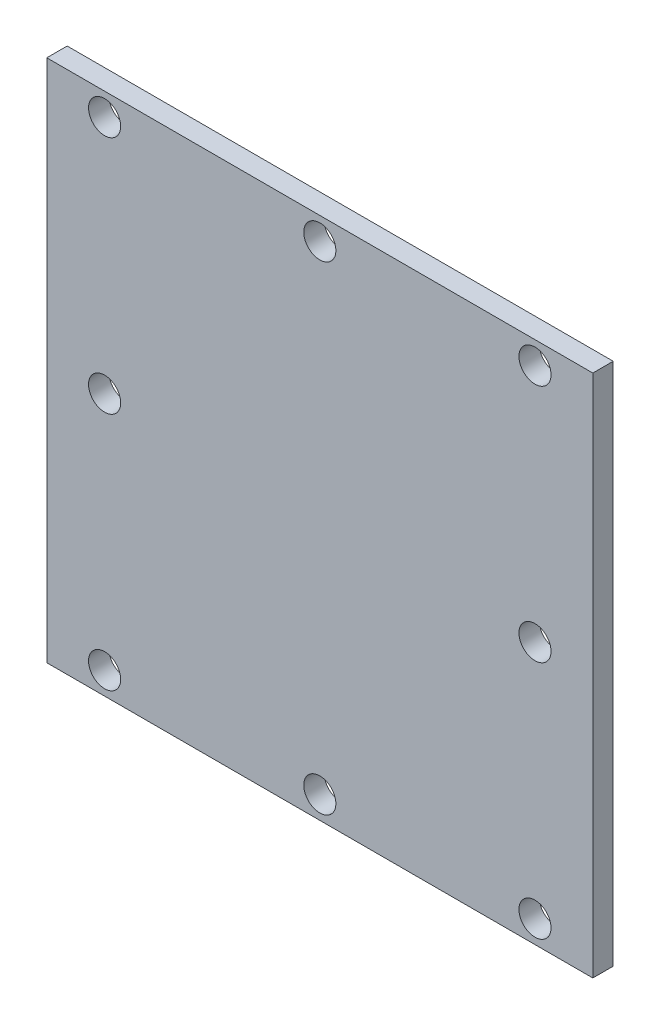
ISO-10303-21;
HEADER;
FILE_DESCRIPTION(('STEP AP214'),'2;1');
FILE_NAME('part.step','',(''),(''),'','','');
FILE_SCHEMA(('AUTOMOTIVE_DESIGN { 1 0 10303 214 1 1 1 1 }'));
ENDSEC;
DATA;
#1=APPLICATION_CONTEXT('core data for automotive mechanical design processes');
#2=APPLICATION_PROTOCOL_DEFINITION('international standard','automotive_design',2000,#1);
#3=PRODUCT_CONTEXT('',#1,'mechanical');
#4=PRODUCT('Part','Part','',(#3));
#5=PRODUCT_RELATED_PRODUCT_CATEGORY('part','',(#4));
#6=PRODUCT_DEFINITION_FORMATION('','',#4);
#7=PRODUCT_DEFINITION_CONTEXT('part definition',#1,'design');
#8=PRODUCT_DEFINITION('design','',#6,#7);
#9=PRODUCT_DEFINITION_SHAPE('','',#8);
#10=(LENGTH_UNIT() NAMED_UNIT(*) SI_UNIT(.MILLI.,.METRE.));
#11=(NAMED_UNIT(*) PLANE_ANGLE_UNIT() SI_UNIT($,.RADIAN.));
#12=(NAMED_UNIT(*) SI_UNIT($,.STERADIAN.) SOLID_ANGLE_UNIT());
#13=UNCERTAINTY_MEASURE_WITH_UNIT(LENGTH_MEASURE(1.E-05),#10,'distance_accuracy_value','');
#14=(GEOMETRIC_REPRESENTATION_CONTEXT(3) GLOBAL_UNCERTAINTY_ASSIGNED_CONTEXT((#13)) GLOBAL_UNIT_ASSIGNED_CONTEXT((#10,
#11,#12)) REPRESENTATION_CONTEXT('',''));
#15=CARTESIAN_POINT('',(0.,0.,0.));
#16=DIRECTION('',(0.,0.,1.));
#17=DIRECTION('',(1.,0.,0.));
#18=AXIS2_PLACEMENT_3D('',#15,#16,#17);
#19=CARTESIAN_POINT('',(170.,0.,-6.35));
#20=DIRECTION('',(0.,-1.,0.));
#21=DIRECTION('',(0.,0.,-1.));
#22=AXIS2_PLACEMENT_3D('',#19,#20,#21);
#23=PLANE('',#22);
#24=DIRECTION('',(1.,0.,0.));
#25=VECTOR('',#24,1.);
#26=CARTESIAN_POINT('',(170.,0.,0.));
#27=LINE('',#26,#25);
#28=CARTESIAN_POINT('',(0.,0.,0.));
#29=VERTEX_POINT('',#28);
#30=CARTESIAN_POINT('',(170.,0.,0.));
#31=VERTEX_POINT('',#30);
#32=EDGE_CURVE('E98',#29,#31,#27,.T.);
#33=ORIENTED_EDGE('',*,*,#32,.F.);
#34=DIRECTION('',(0.,0.,1.));
#35=VECTOR('',#34,1.);
#36=CARTESIAN_POINT('',(0.,0.,-6.35));
#37=LINE('',#36,#35);
#38=CARTESIAN_POINT('',(0.,0.,-6.35));
#39=VERTEX_POINT('',#38);
#40=EDGE_CURVE('E11',#39,#29,#37,.T.);
#41=ORIENTED_EDGE('',*,*,#40,.F.);
#42=DIRECTION('',(1.,0.,0.));
#43=VECTOR('',#42,1.);
#44=CARTESIAN_POINT('',(170.,0.,-6.35));
#45=LINE('',#44,#43);
#46=CARTESIAN_POINT('',(170.,0.,-6.35));
#47=VERTEX_POINT('',#46);
#48=EDGE_CURVE('E91',#39,#47,#45,.T.);
#49=ORIENTED_EDGE('',*,*,#48,.T.);
#50=DIRECTION('',(0.,0.,1.));
#51=VECTOR('',#50,1.);
#52=CARTESIAN_POINT('',(170.,0.,-6.35));
#53=LINE('',#52,#51);
#54=EDGE_CURVE('E36',#47,#31,#53,.T.);
#55=ORIENTED_EDGE('',*,*,#54,.T.);
#56=EDGE_LOOP('',(#33,#41,#49,#55));
#57=FACE_BOUND('',#56,.T.);
#58=ADVANCED_FACE('F33',(#57),#23,.T.);
#59=CARTESIAN_POINT('',(0.,0.,-6.35));
#60=DIRECTION('',(-1.,0.,0.));
#61=DIRECTION('',(0.,0.,1.));
#62=AXIS2_PLACEMENT_3D('',#59,#60,#61);
#63=PLANE('',#62);
#64=DIRECTION('',(0.,-1.,0.));
#65=VECTOR('',#64,1.);
#66=CARTESIAN_POINT('',(0.,0.,0.));
#67=LINE('',#66,#65);
#68=CARTESIAN_POINT('',(0.,163.12,0.));
#69=VERTEX_POINT('',#68);
#70=EDGE_CURVE('E93',#69,#29,#67,.T.);
#71=ORIENTED_EDGE('',*,*,#70,.F.);
#72=DIRECTION('',(0.,0.,1.));
#73=VECTOR('',#72,1.);
#74=CARTESIAN_POINT('',(0.,163.12,-6.35));
#75=LINE('',#74,#73);
#76=CARTESIAN_POINT('',(0.,163.12,-6.35));
#77=VERTEX_POINT('',#76);
#78=EDGE_CURVE('E42',#77,#69,#75,.T.);
#79=ORIENTED_EDGE('',*,*,#78,.F.);
#80=DIRECTION('',(0.,-1.,0.));
#81=VECTOR('',#80,1.);
#82=CARTESIAN_POINT('',(0.,0.,-6.35));
#83=LINE('',#82,#81);
#84=EDGE_CURVE('E88',#77,#39,#83,.T.);
#85=ORIENTED_EDGE('',*,*,#84,.T.);
#86=ORIENTED_EDGE('',*,*,#40,.T.);
#87=EDGE_LOOP('',(#71,#79,#85,#86));
#88=FACE_BOUND('',#87,.T.);
#89=ADVANCED_FACE('F109',(#88),#63,.T.);
#90=CARTESIAN_POINT('',(0.,163.12,-6.35));
#91=DIRECTION('',(0.,1.,0.));
#92=DIRECTION('',(0.,0.,1.));
#93=AXIS2_PLACEMENT_3D('',#90,#91,#92);
#94=PLANE('',#93);
#95=DIRECTION('',(-1.,0.,0.));
#96=VECTOR('',#95,1.);
#97=CARTESIAN_POINT('',(0.,163.12,0.));
#98=LINE('',#97,#96);
#99=CARTESIAN_POINT('',(170.,163.12,0.));
#100=VERTEX_POINT('',#99);
#101=EDGE_CURVE('E83',#100,#69,#98,.T.);
#102=ORIENTED_EDGE('',*,*,#101,.F.);
#103=DIRECTION('',(0.,0.,1.));
#104=VECTOR('',#103,1.);
#105=CARTESIAN_POINT('',(170.,163.12,-6.35));
#106=LINE('',#105,#104);
#107=CARTESIAN_POINT('',(170.,163.12,-6.35));
#108=VERTEX_POINT('',#107);
#109=EDGE_CURVE('E78',#108,#100,#106,.T.);
#110=ORIENTED_EDGE('',*,*,#109,.F.);
#111=DIRECTION('',(-1.,0.,0.));
#112=VECTOR('',#111,1.);
#113=CARTESIAN_POINT('',(0.,163.12,-6.35));
#114=LINE('',#113,#112);
#115=EDGE_CURVE('E81',#108,#77,#114,.T.);
#116=ORIENTED_EDGE('',*,*,#115,.T.);
#117=ORIENTED_EDGE('',*,*,#78,.T.);
#118=EDGE_LOOP('',(#102,#110,#116,#117));
#119=FACE_BOUND('',#118,.T.);
#120=ADVANCED_FACE('F80',(#119),#94,.T.);
#121=CARTESIAN_POINT('',(170.,163.12,-6.35));
#122=DIRECTION('',(1.,0.,0.));
#123=DIRECTION('',(0.,0.,-1.));
#124=AXIS2_PLACEMENT_3D('',#121,#122,#123);
#125=PLANE('',#124);
#126=DIRECTION('',(0.,1.,0.));
#127=VECTOR('',#126,1.);
#128=CARTESIAN_POINT('',(170.,163.12,0.));
#129=LINE('',#128,#127);
#130=EDGE_CURVE('E101',#31,#100,#129,.T.);
#131=ORIENTED_EDGE('',*,*,#130,.F.);
#132=ORIENTED_EDGE('',*,*,#54,.F.);
#133=DIRECTION('',(0.,1.,0.));
#134=VECTOR('',#133,1.);
#135=CARTESIAN_POINT('',(170.,163.12,-6.35));
#136=LINE('',#135,#134);
#137=EDGE_CURVE('E87',#47,#108,#136,.T.);
#138=ORIENTED_EDGE('',*,*,#137,.T.);
#139=ORIENTED_EDGE('',*,*,#109,.T.);
#140=EDGE_LOOP('',(#131,#132,#138,#139));
#141=FACE_BOUND('',#140,.T.);
#142=ADVANCED_FACE('F90',(#141),#125,.T.);
#143=CARTESIAN_POINT('',(0.,0.,-6.35));
#144=DIRECTION('',(0.,0.,-1.));
#145=DIRECTION('',(-1.,0.,0.));
#146=AXIS2_PLACEMENT_3D('',#143,#144,#145);
#147=PLANE('',#146);
#148=CARTESIAN_POINT('',(85.,156.12,-6.35));
#149=DIRECTION('',(0.,0.,1.));
#150=DIRECTION('',(1.,0.,0.));
#151=AXIS2_PLACEMENT_3D('',#148,#149,#150);
#152=CIRCLE('',#151,5.00000000000001);
#153=CARTESIAN_POINT('',(90.,156.12,-6.35));
#154=VERTEX_POINT('',#153);
#155=EDGE_CURVE('E166',#154,#154,#152,.T.);
#156=ORIENTED_EDGE('',*,*,#155,.T.);
#157=EDGE_LOOP('',(#156));
#158=FACE_BOUND('',#157,.T.);
#159=CARTESIAN_POINT('',(152.,156.12,-6.35));
#160=DIRECTION('',(0.,0.,1.));
#161=DIRECTION('',(1.,0.,0.));
#162=AXIS2_PLACEMENT_3D('',#159,#160,#161);
#163=CIRCLE('',#162,4.99999999999999);
#164=CARTESIAN_POINT('',(157.,156.12,-6.35));
#165=VERTEX_POINT('',#164);
#166=EDGE_CURVE('E174',#165,#165,#163,.T.);
#167=ORIENTED_EDGE('',*,*,#166,.T.);
#168=EDGE_LOOP('',(#167));
#169=FACE_BOUND('',#168,.T.);
#170=CARTESIAN_POINT('',(152.,81.56,-6.35));
#171=DIRECTION('',(0.,0.,1.));
#172=DIRECTION('',(1.,0.,0.));
#173=AXIS2_PLACEMENT_3D('',#170,#171,#172);
#174=CIRCLE('',#173,4.99999999999999);
#175=CARTESIAN_POINT('',(157.,81.56,-6.35));
#176=VERTEX_POINT('',#175);
#177=EDGE_CURVE('E180',#176,#176,#174,.T.);
#178=ORIENTED_EDGE('',*,*,#177,.T.);
#179=EDGE_LOOP('',(#178));
#180=FACE_BOUND('',#179,.T.);
#181=CARTESIAN_POINT('',(18.,156.12,-6.35));
#182=DIRECTION('',(0.,0.,1.));
#183=DIRECTION('',(1.,0.,0.));
#184=AXIS2_PLACEMENT_3D('',#181,#182,#183);
#185=CIRCLE('',#184,5.);
#186=CARTESIAN_POINT('',(23.,156.12,-6.35));
#187=VERTEX_POINT('',#186);
#188=EDGE_CURVE('E186',#187,#187,#185,.T.);
#189=ORIENTED_EDGE('',*,*,#188,.T.);
#190=EDGE_LOOP('',(#189));
#191=FACE_BOUND('',#190,.T.);
#192=CARTESIAN_POINT('',(18.,81.56,-6.35));
#193=DIRECTION('',(0.,0.,1.));
#194=DIRECTION('',(1.,0.,0.));
#195=AXIS2_PLACEMENT_3D('',#192,#193,#194);
#196=CIRCLE('',#195,5.);
#197=CARTESIAN_POINT('',(23.,81.56,-6.35));
#198=VERTEX_POINT('',#197);
#199=EDGE_CURVE('E192',#198,#198,#196,.T.);
#200=ORIENTED_EDGE('',*,*,#199,.T.);
#201=EDGE_LOOP('',(#200));
#202=FACE_BOUND('',#201,.T.);
#203=CARTESIAN_POINT('',(18.,7.00000000000003,-6.35));
#204=DIRECTION('',(0.,0.,1.));
#205=DIRECTION('',(1.,0.,0.));
#206=AXIS2_PLACEMENT_3D('',#203,#204,#205);
#207=CIRCLE('',#206,5.);
#208=CARTESIAN_POINT('',(23.,7.00000000000003,-6.35));
#209=VERTEX_POINT('',#208);
#210=EDGE_CURVE('E198',#209,#209,#207,.T.);
#211=ORIENTED_EDGE('',*,*,#210,.T.);
#212=EDGE_LOOP('',(#211));
#213=FACE_BOUND('',#212,.T.);
#214=CARTESIAN_POINT('',(152.,7.00000000000003,-6.35));
#215=DIRECTION('',(0.,0.,1.));
#216=DIRECTION('',(1.,0.,0.));
#217=AXIS2_PLACEMENT_3D('',#214,#215,#216);
#218=CIRCLE('',#217,4.99999999999999);
#219=CARTESIAN_POINT('',(157.,7.00000000000003,-6.35));
#220=VERTEX_POINT('',#219);
#221=EDGE_CURVE('E204',#220,#220,#218,.T.);
#222=ORIENTED_EDGE('',*,*,#221,.T.);
#223=EDGE_LOOP('',(#222));
#224=FACE_BOUND('',#223,.T.);
#225=CARTESIAN_POINT('',(85.,7.00000000000003,-6.35));
#226=DIRECTION('',(0.,0.,1.));
#227=DIRECTION('',(1.,0.,0.));
#228=AXIS2_PLACEMENT_3D('',#225,#226,#227);
#229=CIRCLE('',#228,5.);
#230=CARTESIAN_POINT('',(90.,7.00000000000003,-6.35));
#231=VERTEX_POINT('',#230);
#232=EDGE_CURVE('E102',#231,#231,#229,.T.);
#233=ORIENTED_EDGE('',*,*,#232,.T.);
#234=EDGE_LOOP('',(#233));
#235=FACE_BOUND('',#234,.T.);
#236=ORIENTED_EDGE('',*,*,#48,.F.);
#237=ORIENTED_EDGE('',*,*,#84,.F.);
#238=ORIENTED_EDGE('',*,*,#115,.F.);
#239=ORIENTED_EDGE('',*,*,#137,.F.);
#240=EDGE_LOOP('',(#236,#237,#238,#239));
#241=FACE_BOUND('',#240,.T.);
#242=ADVANCED_FACE('F86',(#158,#169,#180,#191,#202,#213,#224,#235,#241),#147,.T.);
#243=CARTESIAN_POINT('',(0.,0.,0.));
#244=DIRECTION('',(0.,0.,-1.));
#245=DIRECTION('',(-1.,0.,0.));
#246=AXIS2_PLACEMENT_3D('',#243,#244,#245);
#247=PLANE('',#246);
#248=CARTESIAN_POINT('',(85.,156.12,0.));
#249=DIRECTION('',(0.,0.,1.));
#250=DIRECTION('',(1.,0.,0.));
#251=AXIS2_PLACEMENT_3D('',#248,#249,#250);
#252=CIRCLE('',#251,5.00000000000001);
#253=CARTESIAN_POINT('',(90.,156.12,0.));
#254=VERTEX_POINT('',#253);
#255=EDGE_CURVE('E169',#254,#254,#252,.T.);
#256=ORIENTED_EDGE('',*,*,#255,.F.);
#257=EDGE_LOOP('',(#256));
#258=FACE_BOUND('',#257,.T.);
#259=CARTESIAN_POINT('',(152.,156.12,0.));
#260=DIRECTION('',(0.,0.,1.));
#261=DIRECTION('',(1.,0.,0.));
#262=AXIS2_PLACEMENT_3D('',#259,#260,#261);
#263=CIRCLE('',#262,4.99999999999999);
#264=CARTESIAN_POINT('',(157.,156.12,0.));
#265=VERTEX_POINT('',#264);
#266=EDGE_CURVE('E171',#265,#265,#263,.T.);
#267=ORIENTED_EDGE('',*,*,#266,.F.);
#268=EDGE_LOOP('',(#267));
#269=FACE_BOUND('',#268,.T.);
#270=CARTESIAN_POINT('',(152.,81.56,0.));
#271=DIRECTION('',(0.,0.,1.));
#272=DIRECTION('',(1.,0.,0.));
#273=AXIS2_PLACEMENT_3D('',#270,#271,#272);
#274=CIRCLE('',#273,4.99999999999999);
#275=CARTESIAN_POINT('',(157.,81.56,0.));
#276=VERTEX_POINT('',#275);
#277=EDGE_CURVE('E177',#276,#276,#274,.T.);
#278=ORIENTED_EDGE('',*,*,#277,.F.);
#279=EDGE_LOOP('',(#278));
#280=FACE_BOUND('',#279,.T.);
#281=CARTESIAN_POINT('',(18.,156.12,0.));
#282=DIRECTION('',(0.,0.,1.));
#283=DIRECTION('',(1.,0.,0.));
#284=AXIS2_PLACEMENT_3D('',#281,#282,#283);
#285=CIRCLE('',#284,5.);
#286=CARTESIAN_POINT('',(23.,156.12,0.));
#287=VERTEX_POINT('',#286);
#288=EDGE_CURVE('E183',#287,#287,#285,.T.);
#289=ORIENTED_EDGE('',*,*,#288,.F.);
#290=EDGE_LOOP('',(#289));
#291=FACE_BOUND('',#290,.T.);
#292=CARTESIAN_POINT('',(18.,81.56,0.));
#293=DIRECTION('',(0.,0.,1.));
#294=DIRECTION('',(1.,0.,0.));
#295=AXIS2_PLACEMENT_3D('',#292,#293,#294);
#296=CIRCLE('',#295,5.);
#297=CARTESIAN_POINT('',(23.,81.56,0.));
#298=VERTEX_POINT('',#297);
#299=EDGE_CURVE('E189',#298,#298,#296,.T.);
#300=ORIENTED_EDGE('',*,*,#299,.F.);
#301=EDGE_LOOP('',(#300));
#302=FACE_BOUND('',#301,.T.);
#303=CARTESIAN_POINT('',(18.,7.00000000000003,0.));
#304=DIRECTION('',(0.,0.,1.));
#305=DIRECTION('',(1.,0.,0.));
#306=AXIS2_PLACEMENT_3D('',#303,#304,#305);
#307=CIRCLE('',#306,5.);
#308=CARTESIAN_POINT('',(23.,7.00000000000003,0.));
#309=VERTEX_POINT('',#308);
#310=EDGE_CURVE('E195',#309,#309,#307,.T.);
#311=ORIENTED_EDGE('',*,*,#310,.F.);
#312=EDGE_LOOP('',(#311));
#313=FACE_BOUND('',#312,.T.);
#314=CARTESIAN_POINT('',(152.,7.00000000000003,0.));
#315=DIRECTION('',(0.,0.,1.));
#316=DIRECTION('',(1.,0.,0.));
#317=AXIS2_PLACEMENT_3D('',#314,#315,#316);
#318=CIRCLE('',#317,4.99999999999999);
#319=CARTESIAN_POINT('',(157.,7.00000000000003,0.));
#320=VERTEX_POINT('',#319);
#321=EDGE_CURVE('E201',#320,#320,#318,.T.);
#322=ORIENTED_EDGE('',*,*,#321,.F.);
#323=EDGE_LOOP('',(#322));
#324=FACE_BOUND('',#323,.T.);
#325=CARTESIAN_POINT('',(85.,7.00000000000003,0.));
#326=DIRECTION('',(0.,0.,1.));
#327=DIRECTION('',(1.,0.,0.));
#328=AXIS2_PLACEMENT_3D('',#325,#326,#327);
#329=CIRCLE('',#328,5.);
#330=CARTESIAN_POINT('',(90.,7.00000000000003,0.));
#331=VERTEX_POINT('',#330);
#332=EDGE_CURVE('E207',#331,#331,#329,.T.);
#333=ORIENTED_EDGE('',*,*,#332,.F.);
#334=EDGE_LOOP('',(#333));
#335=FACE_BOUND('',#334,.T.);
#336=ORIENTED_EDGE('',*,*,#32,.T.);
#337=ORIENTED_EDGE('',*,*,#130,.T.);
#338=ORIENTED_EDGE('',*,*,#101,.T.);
#339=ORIENTED_EDGE('',*,*,#70,.T.);
#340=EDGE_LOOP('',(#336,#337,#338,#339));
#341=FACE_BOUND('',#340,.T.);
#342=ADVANCED_FACE('F108',(#258,#269,#280,#291,#302,#313,#324,#335,#341),#247,.F.);
#343=CARTESIAN_POINT('',(85.,7.00000000000003,-6.35));
#344=DIRECTION('',(0.,0.,1.));
#345=DIRECTION('',(1.,0.,0.));
#346=AXIS2_PLACEMENT_3D('',#343,#344,#345);
#347=CYLINDRICAL_SURFACE('',#346,5.);
#348=ORIENTED_EDGE('',*,*,#232,.F.);
#349=EDGE_LOOP('',(#348));
#350=FACE_BOUND('',#349,.T.);
#351=ORIENTED_EDGE('',*,*,#332,.T.);
#352=EDGE_LOOP('',(#351));
#353=FACE_BOUND('',#352,.T.);
#354=ADVANCED_FACE('F127',(#350,#353),#347,.F.);
#355=CARTESIAN_POINT('',(152.,7.00000000000003,-6.35));
#356=DIRECTION('',(0.,0.,1.));
#357=DIRECTION('',(1.,0.,0.));
#358=AXIS2_PLACEMENT_3D('',#355,#356,#357);
#359=CYLINDRICAL_SURFACE('',#358,4.99999999999999);
#360=ORIENTED_EDGE('',*,*,#221,.F.);
#361=EDGE_LOOP('',(#360));
#362=FACE_BOUND('',#361,.T.);
#363=ORIENTED_EDGE('',*,*,#321,.T.);
#364=EDGE_LOOP('',(#363));
#365=FACE_BOUND('',#364,.T.);
#366=ADVANCED_FACE('F134',(#362,#365),#359,.F.);
#367=CARTESIAN_POINT('',(18.,7.00000000000003,-6.35));
#368=DIRECTION('',(0.,0.,1.));
#369=DIRECTION('',(1.,0.,0.));
#370=AXIS2_PLACEMENT_3D('',#367,#368,#369);
#371=CYLINDRICAL_SURFACE('',#370,5.);
#372=ORIENTED_EDGE('',*,*,#210,.F.);
#373=EDGE_LOOP('',(#372));
#374=FACE_BOUND('',#373,.T.);
#375=ORIENTED_EDGE('',*,*,#310,.T.);
#376=EDGE_LOOP('',(#375));
#377=FACE_BOUND('',#376,.T.);
#378=ADVANCED_FACE('F138',(#374,#377),#371,.F.);
#379=CARTESIAN_POINT('',(18.,81.56,-6.35));
#380=DIRECTION('',(0.,0.,1.));
#381=DIRECTION('',(1.,0.,0.));
#382=AXIS2_PLACEMENT_3D('',#379,#380,#381);
#383=CYLINDRICAL_SURFACE('',#382,5.);
#384=ORIENTED_EDGE('',*,*,#199,.F.);
#385=EDGE_LOOP('',(#384));
#386=FACE_BOUND('',#385,.T.);
#387=ORIENTED_EDGE('',*,*,#299,.T.);
#388=EDGE_LOOP('',(#387));
#389=FACE_BOUND('',#388,.T.);
#390=ADVANCED_FACE('F142',(#386,#389),#383,.F.);
#391=CARTESIAN_POINT('',(18.,156.12,-6.35));
#392=DIRECTION('',(0.,0.,1.));
#393=DIRECTION('',(1.,0.,0.));
#394=AXIS2_PLACEMENT_3D('',#391,#392,#393);
#395=CYLINDRICAL_SURFACE('',#394,5.);
#396=ORIENTED_EDGE('',*,*,#188,.F.);
#397=EDGE_LOOP('',(#396));
#398=FACE_BOUND('',#397,.T.);
#399=ORIENTED_EDGE('',*,*,#288,.T.);
#400=EDGE_LOOP('',(#399));
#401=FACE_BOUND('',#400,.T.);
#402=ADVANCED_FACE('F146',(#398,#401),#395,.F.);
#403=CARTESIAN_POINT('',(152.,81.56,-6.35));
#404=DIRECTION('',(0.,0.,1.));
#405=DIRECTION('',(1.,0.,0.));
#406=AXIS2_PLACEMENT_3D('',#403,#404,#405);
#407=CYLINDRICAL_SURFACE('',#406,4.99999999999999);
#408=ORIENTED_EDGE('',*,*,#177,.F.);
#409=EDGE_LOOP('',(#408));
#410=FACE_BOUND('',#409,.T.);
#411=ORIENTED_EDGE('',*,*,#277,.T.);
#412=EDGE_LOOP('',(#411));
#413=FACE_BOUND('',#412,.T.);
#414=ADVANCED_FACE('F150',(#410,#413),#407,.F.);
#415=CARTESIAN_POINT('',(152.,156.12,-6.35));
#416=DIRECTION('',(0.,0.,1.));
#417=DIRECTION('',(1.,0.,0.));
#418=AXIS2_PLACEMENT_3D('',#415,#416,#417);
#419=CYLINDRICAL_SURFACE('',#418,4.99999999999999);
#420=ORIENTED_EDGE('',*,*,#166,.F.);
#421=EDGE_LOOP('',(#420));
#422=FACE_BOUND('',#421,.T.);
#423=ORIENTED_EDGE('',*,*,#266,.T.);
#424=EDGE_LOOP('',(#423));
#425=FACE_BOUND('',#424,.T.);
#426=ADVANCED_FACE('F154',(#422,#425),#419,.F.);
#427=CARTESIAN_POINT('',(85.,156.12,-6.35));
#428=DIRECTION('',(0.,0.,1.));
#429=DIRECTION('',(1.,0.,0.));
#430=AXIS2_PLACEMENT_3D('',#427,#428,#429);
#431=CYLINDRICAL_SURFACE('',#430,5.00000000000001);
#432=ORIENTED_EDGE('',*,*,#155,.F.);
#433=EDGE_LOOP('',(#432));
#434=FACE_BOUND('',#433,.T.);
#435=ORIENTED_EDGE('',*,*,#255,.T.);
#436=EDGE_LOOP('',(#435));
#437=FACE_BOUND('',#436,.T.);
#438=ADVANCED_FACE('F158',(#434,#437),#431,.F.);
#439=CLOSED_SHELL('',(#58,#89,#120,#142,#242,#342,#354,#366,#378,#390,#402,#414,#426,#438));
#440=MANIFOLD_SOLID_BREP('B2',#439);
#441=ADVANCED_BREP_SHAPE_REPRESENTATION('',(#18,#440),#14);
#442=SHAPE_DEFINITION_REPRESENTATION(#9,#441);
ENDSEC;
END-ISO-10303-21;
